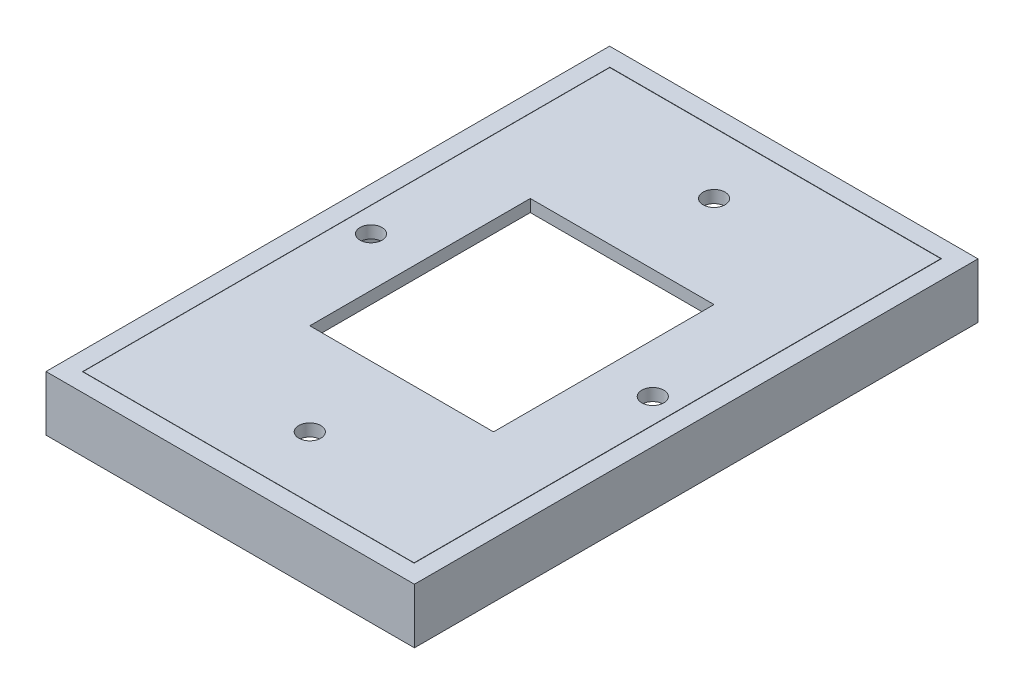
ISO-10303-21;
HEADER;
FILE_DESCRIPTION(('STEP AP214'),'2;1');
FILE_NAME('part.step','',(''),(''),'','','');
FILE_SCHEMA(('AUTOMOTIVE_DESIGN { 1 0 10303 214 1 1 1 1 }'));
ENDSEC;
DATA;
#1=APPLICATION_CONTEXT('core data for automotive mechanical design processes');
#2=APPLICATION_PROTOCOL_DEFINITION('international standard','automotive_design',2000,#1);
#3=PRODUCT_CONTEXT('',#1,'mechanical');
#4=PRODUCT('Part','Part','',(#3));
#5=PRODUCT_RELATED_PRODUCT_CATEGORY('part','',(#4));
#6=PRODUCT_DEFINITION_FORMATION('','',#4);
#7=PRODUCT_DEFINITION_CONTEXT('part definition',#1,'design');
#8=PRODUCT_DEFINITION('design','',#6,#7);
#9=PRODUCT_DEFINITION_SHAPE('','',#8);
#10=(LENGTH_UNIT() NAMED_UNIT(*) SI_UNIT(.MILLI.,.METRE.));
#11=(NAMED_UNIT(*) PLANE_ANGLE_UNIT() SI_UNIT($,.RADIAN.));
#12=(NAMED_UNIT(*) SI_UNIT($,.STERADIAN.) SOLID_ANGLE_UNIT());
#13=UNCERTAINTY_MEASURE_WITH_UNIT(LENGTH_MEASURE(1.E-05),#10,'distance_accuracy_value','');
#14=(GEOMETRIC_REPRESENTATION_CONTEXT(3) GLOBAL_UNCERTAINTY_ASSIGNED_CONTEXT((#13)) GLOBAL_UNIT_ASSIGNED_CONTEXT((#10,
#11,#12)) REPRESENTATION_CONTEXT('',''));
#15=CARTESIAN_POINT('',(0.,0.,0.));
#16=DIRECTION('',(0.,0.,1.));
#17=DIRECTION('',(1.,0.,0.));
#18=AXIS2_PLACEMENT_3D('',#15,#16,#17);
#19=CARTESIAN_POINT('',(-30.067729724105,2.,-46.0110806548268));
#20=DIRECTION('',(-1.,0.,0.));
#21=DIRECTION('',(0.,0.,1.));
#22=AXIS2_PLACEMENT_3D('',#19,#20,#21);
#23=PLANE('',#22);
#24=DIRECTION('',(0.,-1.,0.));
#25=VECTOR('',#24,1.);
#26=CARTESIAN_POINT('',(-30.067729724105,2.,-46.0110806548268));
#27=LINE('',#26,#25);
#28=CARTESIAN_POINT('',(-30.067729724105,2.,-46.0110806548268));
#29=VERTEX_POINT('',#28);
#30=CARTESIAN_POINT('',(-30.067729724105,-7.,-46.0110806548268));
#31=VERTEX_POINT('',#30);
#32=EDGE_CURVE('E58',#29,#31,#27,.T.);
#33=ORIENTED_EDGE('',*,*,#32,.T.);
#34=DIRECTION('',(0.,0.,-1.));
#35=VECTOR('',#34,1.);
#36=CARTESIAN_POINT('',(-30.067729724105,-7.,-46.0110806548268));
#37=LINE('',#36,#35);
#38=CARTESIAN_POINT('',(-30.067729724105,-7.,46.));
#39=VERTEX_POINT('',#38);
#40=EDGE_CURVE('E156',#39,#31,#37,.T.);
#41=ORIENTED_EDGE('',*,*,#40,.F.);
#42=DIRECTION('',(0.,-1.,0.));
#43=VECTOR('',#42,1.);
#44=CARTESIAN_POINT('',(-30.067729724105,2.,46.));
#45=LINE('',#44,#43);
#46=CARTESIAN_POINT('',(-30.067729724105,2.,46.));
#47=VERTEX_POINT('',#46);
#48=EDGE_CURVE('E12',#47,#39,#45,.T.);
#49=ORIENTED_EDGE('',*,*,#48,.F.);
#50=DIRECTION('',(0.,0.,-1.));
#51=VECTOR('',#50,1.);
#52=CARTESIAN_POINT('',(-30.067729724105,2.,-46.0110806548268));
#53=LINE('',#52,#51);
#54=EDGE_CURVE('E184',#47,#29,#53,.T.);
#55=ORIENTED_EDGE('',*,*,#54,.T.);
#56=EDGE_LOOP('',(#33,#41,#49,#55));
#57=FACE_BOUND('',#56,.T.);
#58=ADVANCED_FACE('F55',(#57),#23,.T.);
#59=CARTESIAN_POINT('',(30.082720595895,2.,46.));
#60=DIRECTION('',(0.,0.,1.));
#61=DIRECTION('',(1.,0.,0.));
#62=AXIS2_PLACEMENT_3D('',#59,#60,#61);
#63=PLANE('',#62);
#64=ORIENTED_EDGE('',*,*,#48,.T.);
#65=DIRECTION('',(-1.,0.,0.));
#66=VECTOR('',#65,1.);
#67=CARTESIAN_POINT('',(30.082720595895,-7.,46.));
#68=LINE('',#67,#66);
#69=CARTESIAN_POINT('',(30.082720595895,-7.,46.));
#70=VERTEX_POINT('',#69);
#71=EDGE_CURVE('E168',#70,#39,#68,.T.);
#72=ORIENTED_EDGE('',*,*,#71,.F.);
#73=DIRECTION('',(0.,-1.,0.));
#74=VECTOR('',#73,1.);
#75=CARTESIAN_POINT('',(30.082720595895,2.,46.));
#76=LINE('',#75,#74);
#77=CARTESIAN_POINT('',(30.082720595895,2.,46.));
#78=VERTEX_POINT('',#77);
#79=EDGE_CURVE('E64',#78,#70,#76,.T.);
#80=ORIENTED_EDGE('',*,*,#79,.F.);
#81=DIRECTION('',(-1.,0.,0.));
#82=VECTOR('',#81,1.);
#83=CARTESIAN_POINT('',(30.082720595895,2.,46.));
#84=LINE('',#83,#82);
#85=EDGE_CURVE('E200',#78,#47,#84,.T.);
#86=ORIENTED_EDGE('',*,*,#85,.T.);
#87=EDGE_LOOP('',(#64,#72,#80,#86));
#88=FACE_BOUND('',#87,.T.);
#89=ADVANCED_FACE('F216',(#88),#63,.T.);
#90=CARTESIAN_POINT('',(30.082720595895,2.,-46.0110806548268));
#91=DIRECTION('',(1.,0.,0.));
#92=DIRECTION('',(0.,0.,-1.));
#93=AXIS2_PLACEMENT_3D('',#90,#91,#92);
#94=PLANE('',#93);
#95=ORIENTED_EDGE('',*,*,#79,.T.);
#96=DIRECTION('',(0.,0.,1.));
#97=VECTOR('',#96,1.);
#98=CARTESIAN_POINT('',(30.082720595895,-7.,-46.0110806548268));
#99=LINE('',#98,#97);
#100=CARTESIAN_POINT('',(30.082720595895,-7.,-46.0110806548268));
#101=VERTEX_POINT('',#100);
#102=EDGE_CURVE('E164',#101,#70,#99,.T.);
#103=ORIENTED_EDGE('',*,*,#102,.F.);
#104=DIRECTION('',(0.,-1.,0.));
#105=VECTOR('',#104,1.);
#106=CARTESIAN_POINT('',(30.082720595895,2.,-46.0110806548268));
#107=LINE('',#106,#105);
#108=CARTESIAN_POINT('',(30.082720595895,2.,-46.0110806548268));
#109=VERTEX_POINT('',#108);
#110=EDGE_CURVE('E205',#109,#101,#107,.T.);
#111=ORIENTED_EDGE('',*,*,#110,.F.);
#112=DIRECTION('',(0.,0.,1.));
#113=VECTOR('',#112,1.);
#114=CARTESIAN_POINT('',(30.082720595895,2.,-46.0110806548268));
#115=LINE('',#114,#113);
#116=EDGE_CURVE('E196',#109,#78,#115,.T.);
#117=ORIENTED_EDGE('',*,*,#116,.T.);
#118=EDGE_LOOP('',(#95,#103,#111,#117));
#119=FACE_BOUND('',#118,.T.);
#120=ADVANCED_FACE('F222',(#119),#94,.T.);
#121=CARTESIAN_POINT('',(30.082720595895,2.,-46.0110806548268));
#122=DIRECTION('',(0.,0.,-1.));
#123=DIRECTION('',(-1.,0.,0.));
#124=AXIS2_PLACEMENT_3D('',#121,#122,#123);
#125=PLANE('',#124);
#126=ORIENTED_EDGE('',*,*,#110,.T.);
#127=DIRECTION('',(1.,0.,0.));
#128=VECTOR('',#127,1.);
#129=CARTESIAN_POINT('',(30.082720595895,-7.,-46.0110806548268));
#130=LINE('',#129,#128);
#131=EDGE_CURVE('E160',#31,#101,#130,.T.);
#132=ORIENTED_EDGE('',*,*,#131,.F.);
#133=ORIENTED_EDGE('',*,*,#32,.F.);
#134=DIRECTION('',(1.,0.,0.));
#135=VECTOR('',#134,1.);
#136=CARTESIAN_POINT('',(30.082720595895,2.,-46.0110806548268));
#137=LINE('',#136,#135);
#138=EDGE_CURVE('E192',#29,#109,#137,.T.);
#139=ORIENTED_EDGE('',*,*,#138,.T.);
#140=EDGE_LOOP('',(#126,#132,#133,#139));
#141=FACE_BOUND('',#140,.T.);
#142=ADVANCED_FACE('F211',(#141),#125,.T.);
#143=CARTESIAN_POINT('',(0.,2.,0.));
#144=DIRECTION('',(0.,-1.,0.));
#145=DIRECTION('',(0.,0.,-1.));
#146=AXIS2_PLACEMENT_3D('',#143,#144,#145);
#147=PLANE('',#146);
#148=DIRECTION('',(-1.,0.,0.));
#149=VECTOR('',#148,1.);
#150=CARTESIAN_POINT('',(27.082720595895,2.,43.0444596725866));
#151=LINE('',#150,#149);
#152=CARTESIAN_POINT('',(27.082720595895,2.,43.0444596725866));
#153=VERTEX_POINT('',#152);
#154=CARTESIAN_POINT('',(-27.067729724105,2.,43.0444596725866));
#155=VERTEX_POINT('',#154);
#156=EDGE_CURVE('E134',#153,#155,#151,.T.);
#157=ORIENTED_EDGE('',*,*,#156,.T.);
#158=DIRECTION('',(0.,0.,-1.));
#159=VECTOR('',#158,1.);
#160=CARTESIAN_POINT('',(-27.067729724105,2.,-43.0555403274134));
#161=LINE('',#160,#159);
#162=CARTESIAN_POINT('',(-27.067729724105,2.,-43.0555403274134));
#163=VERTEX_POINT('',#162);
#164=EDGE_CURVE('E172',#155,#163,#161,.T.);
#165=ORIENTED_EDGE('',*,*,#164,.T.);
#166=DIRECTION('',(1.,0.,0.));
#167=VECTOR('',#166,1.);
#168=CARTESIAN_POINT('',(27.082720595895,2.,-43.0555403274134));
#169=LINE('',#168,#167);
#170=CARTESIAN_POINT('',(27.082720595895,2.,-43.0555403274134));
#171=VERTEX_POINT('',#170);
#172=EDGE_CURVE('E128',#163,#171,#169,.T.);
#173=ORIENTED_EDGE('',*,*,#172,.T.);
#174=DIRECTION('',(0.,0.,1.));
#175=VECTOR('',#174,1.);
#176=CARTESIAN_POINT('',(27.082720595895,2.,-43.0555403274134));
#177=LINE('',#176,#175);
#178=EDGE_CURVE('E72',#171,#153,#177,.T.);
#179=ORIENTED_EDGE('',*,*,#178,.T.);
#180=EDGE_LOOP('',(#157,#165,#173,#179));
#181=FACE_BOUND('',#180,.T.);
#182=ORIENTED_EDGE('',*,*,#54,.F.);
#183=ORIENTED_EDGE('',*,*,#85,.F.);
#184=ORIENTED_EDGE('',*,*,#116,.F.);
#185=ORIENTED_EDGE('',*,*,#138,.F.);
#186=EDGE_LOOP('',(#182,#183,#184,#185));
#187=FACE_BOUND('',#186,.T.);
#188=ADVANCED_FACE('F220',(#181,#187),#147,.F.);
#189=CARTESIAN_POINT('',(-27.067729724105,2.,-43.0555403274134));
#190=DIRECTION('',(-1.,0.,0.));
#191=DIRECTION('',(0.,0.,1.));
#192=AXIS2_PLACEMENT_3D('',#189,#190,#191);
#193=PLANE('',#192);
#194=DIRECTION('',(0.,-1.,0.));
#195=VECTOR('',#194,1.);
#196=CARTESIAN_POINT('',(-27.067729724105,2.,43.0444596725866));
#197=LINE('',#196,#195);
#198=CARTESIAN_POINT('',(-27.067729724105,-7.,43.0444596725866));
#199=VERTEX_POINT('',#198);
#200=EDGE_CURVE('E139',#155,#199,#197,.T.);
#201=ORIENTED_EDGE('',*,*,#200,.T.);
#202=DIRECTION('',(0.,0.,-1.));
#203=VECTOR('',#202,1.);
#204=CARTESIAN_POINT('',(-27.067729724105,-7.,-43.0555403274134));
#205=LINE('',#204,#203);
#206=CARTESIAN_POINT('',(-27.067729724105,-7.,-43.0555403274134));
#207=VERTEX_POINT('',#206);
#208=EDGE_CURVE('E137',#199,#207,#205,.T.);
#209=ORIENTED_EDGE('',*,*,#208,.T.);
#210=DIRECTION('',(0.,-1.,0.));
#211=VECTOR('',#210,1.);
#212=CARTESIAN_POINT('',(-27.067729724105,2.,-43.0555403274134));
#213=LINE('',#212,#211);
#214=EDGE_CURVE('E121',#163,#207,#213,.T.);
#215=ORIENTED_EDGE('',*,*,#214,.F.);
#216=ORIENTED_EDGE('',*,*,#164,.F.);
#217=EDGE_LOOP('',(#201,#209,#215,#216));
#218=FACE_BOUND('',#217,.T.);
#219=ADVANCED_FACE('F138',(#218),#193,.F.);
#220=CARTESIAN_POINT('',(27.082720595895,2.,43.0444596725866));
#221=DIRECTION('',(0.,0.,1.));
#222=DIRECTION('',(1.,0.,0.));
#223=AXIS2_PLACEMENT_3D('',#220,#221,#222);
#224=PLANE('',#223);
#225=DIRECTION('',(0.,-1.,0.));
#226=VECTOR('',#225,1.);
#227=CARTESIAN_POINT('',(27.082720595895,2.,43.0444596725866));
#228=LINE('',#227,#226);
#229=CARTESIAN_POINT('',(27.082720595895,-7.,43.0444596725866));
#230=VERTEX_POINT('',#229);
#231=EDGE_CURVE('E185',#153,#230,#228,.T.);
#232=ORIENTED_EDGE('',*,*,#231,.T.);
#233=DIRECTION('',(-1.,0.,0.));
#234=VECTOR('',#233,1.);
#235=CARTESIAN_POINT('',(27.082720595895,-7.,43.0444596725866));
#236=LINE('',#235,#234);
#237=EDGE_CURVE('E151',#230,#199,#236,.T.);
#238=ORIENTED_EDGE('',*,*,#237,.T.);
#239=ORIENTED_EDGE('',*,*,#200,.F.);
#240=ORIENTED_EDGE('',*,*,#156,.F.);
#241=EDGE_LOOP('',(#232,#238,#239,#240));
#242=FACE_BOUND('',#241,.T.);
#243=ADVANCED_FACE('F267',(#242),#224,.F.);
#244=CARTESIAN_POINT('',(27.082720595895,2.,-43.0555403274134));
#245=DIRECTION('',(1.,0.,0.));
#246=DIRECTION('',(0.,0.,-1.));
#247=AXIS2_PLACEMENT_3D('',#244,#245,#246);
#248=PLANE('',#247);
#249=DIRECTION('',(0.,-1.,0.));
#250=VECTOR('',#249,1.);
#251=CARTESIAN_POINT('',(27.082720595895,2.,-43.0555403274134));
#252=LINE('',#251,#250);
#253=CARTESIAN_POINT('',(27.082720595895,-7.,-43.0555403274134));
#254=VERTEX_POINT('',#253);
#255=EDGE_CURVE('E133',#171,#254,#252,.T.);
#256=ORIENTED_EDGE('',*,*,#255,.T.);
#257=DIRECTION('',(0.,0.,1.));
#258=VECTOR('',#257,1.);
#259=CARTESIAN_POINT('',(27.082720595895,-7.,-43.0555403274134));
#260=LINE('',#259,#258);
#261=EDGE_CURVE('E147',#254,#230,#260,.T.);
#262=ORIENTED_EDGE('',*,*,#261,.T.);
#263=ORIENTED_EDGE('',*,*,#231,.F.);
#264=ORIENTED_EDGE('',*,*,#178,.F.);
#265=EDGE_LOOP('',(#256,#262,#263,#264));
#266=FACE_BOUND('',#265,.T.);
#267=ADVANCED_FACE('F276',(#266),#248,.F.);
#268=CARTESIAN_POINT('',(27.082720595895,2.,-43.0555403274134));
#269=DIRECTION('',(0.,0.,-1.));
#270=DIRECTION('',(-1.,0.,0.));
#271=AXIS2_PLACEMENT_3D('',#268,#269,#270);
#272=PLANE('',#271);
#273=ORIENTED_EDGE('',*,*,#214,.T.);
#274=DIRECTION('',(1.,0.,0.));
#275=VECTOR('',#274,1.);
#276=CARTESIAN_POINT('',(27.082720595895,-7.,-43.0555403274134));
#277=LINE('',#276,#275);
#278=EDGE_CURVE('E125',#207,#254,#277,.T.);
#279=ORIENTED_EDGE('',*,*,#278,.T.);
#280=ORIENTED_EDGE('',*,*,#255,.F.);
#281=ORIENTED_EDGE('',*,*,#172,.F.);
#282=EDGE_LOOP('',(#273,#279,#280,#281));
#283=FACE_BOUND('',#282,.T.);
#284=ADVANCED_FACE('F123',(#283),#272,.F.);
#285=CARTESIAN_POINT('',(0.,-7.,0.));
#286=DIRECTION('',(0.,-1.,0.));
#287=DIRECTION('',(0.,0.,-1.));
#288=AXIS2_PLACEMENT_3D('',#285,#286,#287);
#289=PLANE('',#288);
#290=ORIENTED_EDGE('',*,*,#40,.T.);
#291=ORIENTED_EDGE('',*,*,#131,.T.);
#292=ORIENTED_EDGE('',*,*,#102,.T.);
#293=ORIENTED_EDGE('',*,*,#71,.T.);
#294=EDGE_LOOP('',(#290,#291,#292,#293));
#295=FACE_BOUND('',#294,.T.);
#296=ORIENTED_EDGE('',*,*,#278,.F.);
#297=ORIENTED_EDGE('',*,*,#208,.F.);
#298=ORIENTED_EDGE('',*,*,#237,.F.);
#299=ORIENTED_EDGE('',*,*,#261,.F.);
#300=EDGE_LOOP('',(#296,#297,#298,#299));
#301=FACE_BOUND('',#300,.T.);
#302=ADVANCED_FACE('F145',(#295,#301),#289,.T.);
#303=CLOSED_SHELL('',(#58,#89,#120,#142,#188,#219,#243,#267,#284,#302));
#304=MANIFOLD_SOLID_BREP('B2',#303);
#305=CARTESIAN_POINT('',(15.,2.,0.));
#306=DIRECTION('',(-1.,0.,0.));
#307=DIRECTION('',(0.,0.,1.));
#308=AXIS2_PLACEMENT_3D('',#305,#306,#307);
#309=PLANE('',#308);
#310=DIRECTION('',(0.,0.,-1.));
#311=VECTOR('',#310,1.);
#312=CARTESIAN_POINT('',(15.,0.,0.));
#313=LINE('',#312,#311);
#314=CARTESIAN_POINT('',(15.,0.,18.));
#315=VERTEX_POINT('',#314);
#316=CARTESIAN_POINT('',(15.,0.,-18.));
#317=VERTEX_POINT('',#316);
#318=EDGE_CURVE('E421',#315,#317,#313,.T.);
#319=ORIENTED_EDGE('',*,*,#318,.F.);
#320=DIRECTION('',(0.,-1.,0.));
#321=VECTOR('',#320,1.);
#322=CARTESIAN_POINT('',(15.,2.,18.));
#323=LINE('',#322,#321);
#324=CARTESIAN_POINT('',(15.,2.,18.));
#325=VERTEX_POINT('',#324);
#326=EDGE_CURVE('E53',#325,#315,#323,.T.);
#327=ORIENTED_EDGE('',*,*,#326,.F.);
#328=DIRECTION('',(0.,0.,-1.));
#329=VECTOR('',#328,1.);
#330=CARTESIAN_POINT('',(15.,2.,0.));
#331=LINE('',#330,#329);
#332=CARTESIAN_POINT('',(15.,2.,-18.));
#333=VERTEX_POINT('',#332);
#334=EDGE_CURVE('E401',#325,#333,#331,.T.);
#335=ORIENTED_EDGE('',*,*,#334,.T.);
#336=DIRECTION('',(0.,-1.,0.));
#337=VECTOR('',#336,1.);
#338=CARTESIAN_POINT('',(15.,2.,-18.));
#339=LINE('',#338,#337);
#340=EDGE_CURVE('E363',#333,#317,#339,.T.);
#341=ORIENTED_EDGE('',*,*,#340,.T.);
#342=EDGE_LOOP('',(#319,#327,#335,#341));
#343=FACE_BOUND('',#342,.T.);
#344=ADVANCED_FACE('F309',(#343),#309,.T.);
#345=CARTESIAN_POINT('',(0.,2.,18.));
#346=DIRECTION('',(0.,0.,-1.));
#347=DIRECTION('',(-1.,0.,0.));
#348=AXIS2_PLACEMENT_3D('',#345,#346,#347);
#349=PLANE('',#348);
#350=DIRECTION('',(1.,0.,0.));
#351=VECTOR('',#350,1.);
#352=CARTESIAN_POINT('',(0.,0.,18.));
#353=LINE('',#352,#351);
#354=CARTESIAN_POINT('',(-15.,0.,18.));
#355=VERTEX_POINT('',#354);
#356=EDGE_CURVE('E391',#355,#315,#353,.T.);
#357=ORIENTED_EDGE('',*,*,#356,.F.);
#358=DIRECTION('',(0.,-1.,0.));
#359=VECTOR('',#358,1.);
#360=CARTESIAN_POINT('',(-15.,2.,18.));
#361=LINE('',#360,#359);
#362=CARTESIAN_POINT('',(-15.,2.,18.));
#363=VERTEX_POINT('',#362);
#364=EDGE_CURVE('E319',#363,#355,#361,.T.);
#365=ORIENTED_EDGE('',*,*,#364,.F.);
#366=DIRECTION('',(1.,0.,0.));
#367=VECTOR('',#366,1.);
#368=CARTESIAN_POINT('',(0.,2.,18.));
#369=LINE('',#368,#367);
#370=EDGE_CURVE('E389',#363,#325,#369,.T.);
#371=ORIENTED_EDGE('',*,*,#370,.T.);
#372=ORIENTED_EDGE('',*,*,#326,.T.);
#373=EDGE_LOOP('',(#357,#365,#371,#372));
#374=FACE_BOUND('',#373,.T.);
#375=ADVANCED_FACE('F387',(#374),#349,.T.);
#376=CARTESIAN_POINT('',(-15.,2.,0.));
#377=DIRECTION('',(-1.,0.,0.));
#378=DIRECTION('',(0.,0.,1.));
#379=AXIS2_PLACEMENT_3D('',#376,#377,#378);
#380=PLANE('',#379);
#381=DIRECTION('',(0.,0.,-1.));
#382=VECTOR('',#381,1.);
#383=CARTESIAN_POINT('',(-15.,0.,0.));
#384=LINE('',#383,#382);
#385=CARTESIAN_POINT('',(-15.,0.,-18.));
#386=VERTEX_POINT('',#385);
#387=EDGE_CURVE('E424',#355,#386,#384,.T.);
#388=ORIENTED_EDGE('',*,*,#387,.T.);
#389=DIRECTION('',(0.,-1.,0.));
#390=VECTOR('',#389,1.);
#391=CARTESIAN_POINT('',(-15.,2.,-18.));
#392=LINE('',#391,#390);
#393=CARTESIAN_POINT('',(-15.,2.,-18.));
#394=VERTEX_POINT('',#393);
#395=EDGE_CURVE('E394',#394,#386,#392,.T.);
#396=ORIENTED_EDGE('',*,*,#395,.F.);
#397=DIRECTION('',(0.,0.,-1.));
#398=VECTOR('',#397,1.);
#399=CARTESIAN_POINT('',(-15.,2.,0.));
#400=LINE('',#399,#398);
#401=EDGE_CURVE('E397',#363,#394,#400,.T.);
#402=ORIENTED_EDGE('',*,*,#401,.F.);
#403=ORIENTED_EDGE('',*,*,#364,.T.);
#404=EDGE_LOOP('',(#388,#396,#402,#403));
#405=FACE_BOUND('',#404,.T.);
#406=ADVANCED_FACE('F398',(#405),#380,.F.);
#407=CARTESIAN_POINT('',(-27.025,2.,0.));
#408=DIRECTION('',(-1.,0.,0.));
#409=DIRECTION('',(0.,0.,1.));
#410=AXIS2_PLACEMENT_3D('',#407,#408,#409);
#411=PLANE('',#410);
#412=DIRECTION('',(0.,0.,-1.));
#413=VECTOR('',#412,1.);
#414=CARTESIAN_POINT('',(-27.025,0.,0.));
#415=LINE('',#414,#413);
#416=CARTESIAN_POINT('',(-27.025,0.,43.));
#417=VERTEX_POINT('',#416);
#418=CARTESIAN_POINT('',(-27.025,0.,-43.));
#419=VERTEX_POINT('',#418);
#420=EDGE_CURVE('E409',#417,#419,#415,.T.);
#421=ORIENTED_EDGE('',*,*,#420,.F.);
#422=DIRECTION('',(0.,-1.,0.));
#423=VECTOR('',#422,1.);
#424=CARTESIAN_POINT('',(-27.025,2.,43.));
#425=LINE('',#424,#423);
#426=CARTESIAN_POINT('',(-27.025,2.,43.));
#427=VERTEX_POINT('',#426);
#428=EDGE_CURVE('E313',#427,#417,#425,.T.);
#429=ORIENTED_EDGE('',*,*,#428,.F.);
#430=DIRECTION('',(0.,0.,-1.));
#431=VECTOR('',#430,1.);
#432=CARTESIAN_POINT('',(-27.025,2.,0.));
#433=LINE('',#432,#431);
#434=CARTESIAN_POINT('',(-27.025,2.,-43.));
#435=VERTEX_POINT('',#434);
#436=EDGE_CURVE('E427',#427,#435,#433,.T.);
#437=ORIENTED_EDGE('',*,*,#436,.T.);
#438=DIRECTION('',(0.,-1.,0.));
#439=VECTOR('',#438,1.);
#440=CARTESIAN_POINT('',(-27.025,2.,-43.));
#441=LINE('',#440,#439);
#442=EDGE_CURVE('E408',#435,#419,#441,.T.);
#443=ORIENTED_EDGE('',*,*,#442,.T.);
#444=EDGE_LOOP('',(#421,#429,#437,#443));
#445=FACE_BOUND('',#444,.T.);
#446=ADVANCED_FACE('F311',(#445),#411,.T.);
#447=CARTESIAN_POINT('',(0.,2.,43.));
#448=DIRECTION('',(0.,0.,1.));
#449=DIRECTION('',(1.,0.,0.));
#450=AXIS2_PLACEMENT_3D('',#447,#448,#449);
#451=PLANE('',#450);
#452=DIRECTION('',(-1.,0.,0.));
#453=VECTOR('',#452,1.);
#454=CARTESIAN_POINT('',(0.,0.,43.));
#455=LINE('',#454,#453);
#456=CARTESIAN_POINT('',(27.025,0.,43.));
#457=VERTEX_POINT('',#456);
#458=EDGE_CURVE('E412',#457,#417,#455,.T.);
#459=ORIENTED_EDGE('',*,*,#458,.F.);
#460=DIRECTION('',(0.,-1.,0.));
#461=VECTOR('',#460,1.);
#462=CARTESIAN_POINT('',(27.025,2.,43.));
#463=LINE('',#462,#461);
#464=CARTESIAN_POINT('',(27.025,2.,43.));
#465=VERTEX_POINT('',#464);
#466=EDGE_CURVE('E433',#465,#457,#463,.T.);
#467=ORIENTED_EDGE('',*,*,#466,.F.);
#468=DIRECTION('',(-1.,0.,0.));
#469=VECTOR('',#468,1.);
#470=CARTESIAN_POINT('',(0.,2.,43.));
#471=LINE('',#470,#469);
#472=EDGE_CURVE('E442',#465,#427,#471,.T.);
#473=ORIENTED_EDGE('',*,*,#472,.T.);
#474=ORIENTED_EDGE('',*,*,#428,.T.);
#475=EDGE_LOOP('',(#459,#467,#473,#474));
#476=FACE_BOUND('',#475,.T.);
#477=ADVANCED_FACE('F440',(#476),#451,.T.);
#478=CARTESIAN_POINT('',(27.025,2.,0.));
#479=DIRECTION('',(-1.,0.,0.));
#480=DIRECTION('',(0.,0.,1.));
#481=AXIS2_PLACEMENT_3D('',#478,#479,#480);
#482=PLANE('',#481);
#483=DIRECTION('',(0.,0.,-1.));
#484=VECTOR('',#483,1.);
#485=CARTESIAN_POINT('',(27.025,0.,0.));
#486=LINE('',#485,#484);
#487=CARTESIAN_POINT('',(27.025,0.,-43.));
#488=VERTEX_POINT('',#487);
#489=EDGE_CURVE('E416',#457,#488,#486,.T.);
#490=ORIENTED_EDGE('',*,*,#489,.T.);
#491=DIRECTION('',(0.,-1.,0.));
#492=VECTOR('',#491,1.);
#493=CARTESIAN_POINT('',(27.025,2.,-43.));
#494=LINE('',#493,#492);
#495=CARTESIAN_POINT('',(27.025,2.,-43.));
#496=VERTEX_POINT('',#495);
#497=EDGE_CURVE('E431',#496,#488,#494,.T.);
#498=ORIENTED_EDGE('',*,*,#497,.F.);
#499=DIRECTION('',(0.,0.,-1.));
#500=VECTOR('',#499,1.);
#501=CARTESIAN_POINT('',(27.025,2.,0.));
#502=LINE('',#501,#500);
#503=EDGE_CURVE('E453',#465,#496,#502,.T.);
#504=ORIENTED_EDGE('',*,*,#503,.F.);
#505=ORIENTED_EDGE('',*,*,#466,.T.);
#506=EDGE_LOOP('',(#490,#498,#504,#505));
#507=FACE_BOUND('',#506,.T.);
#508=ADVANCED_FACE('F448',(#507),#482,.F.);
#509=CARTESIAN_POINT('',(0.,2.,-43.));
#510=DIRECTION('',(0.,0.,1.));
#511=DIRECTION('',(1.,0.,0.));
#512=AXIS2_PLACEMENT_3D('',#509,#510,#511);
#513=PLANE('',#512);
#514=DIRECTION('',(-1.,0.,0.));
#515=VECTOR('',#514,1.);
#516=CARTESIAN_POINT('',(0.,0.,-43.));
#517=LINE('',#516,#515);
#518=EDGE_CURVE('E418',#488,#419,#517,.T.);
#519=ORIENTED_EDGE('',*,*,#518,.T.);
#520=ORIENTED_EDGE('',*,*,#442,.F.);
#521=DIRECTION('',(-1.,0.,0.));
#522=VECTOR('',#521,1.);
#523=CARTESIAN_POINT('',(0.,2.,-43.));
#524=LINE('',#523,#522);
#525=EDGE_CURVE('E403',#496,#435,#524,.T.);
#526=ORIENTED_EDGE('',*,*,#525,.F.);
#527=ORIENTED_EDGE('',*,*,#497,.T.);
#528=EDGE_LOOP('',(#519,#520,#526,#527));
#529=FACE_BOUND('',#528,.T.);
#530=ADVANCED_FACE('F451',(#529),#513,.F.);
#531=CARTESIAN_POINT('',(0.,2.,-18.));
#532=DIRECTION('',(0.,0.,-1.));
#533=DIRECTION('',(-1.,0.,0.));
#534=AXIS2_PLACEMENT_3D('',#531,#532,#533);
#535=PLANE('',#534);
#536=DIRECTION('',(1.,0.,0.));
#537=VECTOR('',#536,1.);
#538=CARTESIAN_POINT('',(0.,0.,-18.));
#539=LINE('',#538,#537);
#540=EDGE_CURVE('E356',#386,#317,#539,.T.);
#541=ORIENTED_EDGE('',*,*,#540,.T.);
#542=ORIENTED_EDGE('',*,*,#340,.F.);
#543=DIRECTION('',(1.,0.,0.));
#544=VECTOR('',#543,1.);
#545=CARTESIAN_POINT('',(0.,2.,-18.));
#546=LINE('',#545,#544);
#547=EDGE_CURVE('E328',#394,#333,#546,.T.);
#548=ORIENTED_EDGE('',*,*,#547,.F.);
#549=ORIENTED_EDGE('',*,*,#395,.T.);
#550=EDGE_LOOP('',(#541,#542,#548,#549));
#551=FACE_BOUND('',#550,.T.);
#552=ADVANCED_FACE('F493',(#551),#535,.F.);
#553=CARTESIAN_POINT('',(0.,2.,0.));
#554=DIRECTION('',(0.,1.,0.));
#555=DIRECTION('',(0.,0.,1.));
#556=AXIS2_PLACEMENT_3D('',#553,#554,#555);
#557=PLANE('',#556);
#558=CARTESIAN_POINT('',(0.,2.,33.));
#559=DIRECTION('',(0.,1.,0.));
#560=DIRECTION('',(0.,0.,1.));
#561=AXIS2_PLACEMENT_3D('',#558,#559,#560);
#562=CIRCLE('',#561,1.8);
#563=CARTESIAN_POINT('',(0.,2.,34.8));
#564=VERTEX_POINT('',#563);
#565=EDGE_CURVE('E476',#564,#564,#562,.T.);
#566=ORIENTED_EDGE('',*,*,#565,.F.);
#567=EDGE_LOOP('',(#566));
#568=FACE_BOUND('',#567,.T.);
#569=CARTESIAN_POINT('',(-23.,2.,0.));
#570=DIRECTION('',(0.,1.,0.));
#571=DIRECTION('',(0.,0.,1.));
#572=AXIS2_PLACEMENT_3D('',#569,#570,#571);
#573=CIRCLE('',#572,1.79999999999999);
#574=CARTESIAN_POINT('',(-23.,2.,1.79999999999999));
#575=VERTEX_POINT('',#574);
#576=EDGE_CURVE('E473',#575,#575,#573,.T.);
#577=ORIENTED_EDGE('',*,*,#576,.F.);
#578=EDGE_LOOP('',(#577));
#579=FACE_BOUND('',#578,.T.);
#580=CARTESIAN_POINT('',(0.,2.,-33.));
#581=DIRECTION('',(0.,1.,0.));
#582=DIRECTION('',(0.,0.,-1.));
#583=AXIS2_PLACEMENT_3D('',#580,#581,#582);
#584=CIRCLE('',#583,1.8);
#585=CARTESIAN_POINT('',(0.,2.,-34.8));
#586=VERTEX_POINT('',#585);
#587=EDGE_CURVE('E467',#586,#586,#584,.T.);
#588=ORIENTED_EDGE('',*,*,#587,.F.);
#589=EDGE_LOOP('',(#588));
#590=FACE_BOUND('',#589,.T.);
#591=CARTESIAN_POINT('',(23.,2.,0.));
#592=DIRECTION('',(0.,1.,0.));
#593=DIRECTION('',(0.,0.,-1.));
#594=AXIS2_PLACEMENT_3D('',#591,#592,#593);
#595=CIRCLE('',#594,1.79999999999999);
#596=CARTESIAN_POINT('',(23.,2.,-1.8));
#597=VERTEX_POINT('',#596);
#598=EDGE_CURVE('E461',#597,#597,#595,.T.);
#599=ORIENTED_EDGE('',*,*,#598,.F.);
#600=EDGE_LOOP('',(#599));
#601=FACE_BOUND('',#600,.T.);
#602=ORIENTED_EDGE('',*,*,#436,.F.);
#603=ORIENTED_EDGE('',*,*,#472,.F.);
#604=ORIENTED_EDGE('',*,*,#503,.T.);
#605=ORIENTED_EDGE('',*,*,#525,.T.);
#606=EDGE_LOOP('',(#602,#603,#604,#605));
#607=FACE_BOUND('',#606,.T.);
#608=ORIENTED_EDGE('',*,*,#334,.F.);
#609=ORIENTED_EDGE('',*,*,#370,.F.);
#610=ORIENTED_EDGE('',*,*,#401,.T.);
#611=ORIENTED_EDGE('',*,*,#547,.T.);
#612=EDGE_LOOP('',(#608,#609,#610,#611));
#613=FACE_BOUND('',#612,.T.);
#614=ADVANCED_FACE('F400',(#568,#579,#590,#601,#607,#613),#557,.T.);
#615=CARTESIAN_POINT('',(0.,0.,0.));
#616=DIRECTION('',(0.,1.,0.));
#617=DIRECTION('',(0.,0.,1.));
#618=AXIS2_PLACEMENT_3D('',#615,#616,#617);
#619=PLANE('',#618);
#620=CARTESIAN_POINT('',(0.,0.,33.));
#621=DIRECTION('',(0.,1.,0.));
#622=DIRECTION('',(0.,0.,1.));
#623=AXIS2_PLACEMENT_3D('',#620,#621,#622);
#624=CIRCLE('',#623,1.8);
#625=CARTESIAN_POINT('',(0.,0.,34.8));
#626=VERTEX_POINT('',#625);
#627=EDGE_CURVE('E413',#626,#626,#624,.T.);
#628=ORIENTED_EDGE('',*,*,#627,.T.);
#629=EDGE_LOOP('',(#628));
#630=FACE_BOUND('',#629,.T.);
#631=CARTESIAN_POINT('',(-23.,0.,0.));
#632=DIRECTION('',(0.,1.,0.));
#633=DIRECTION('',(0.,0.,1.));
#634=AXIS2_PLACEMENT_3D('',#631,#632,#633);
#635=CIRCLE('',#634,1.79999999999999);
#636=CARTESIAN_POINT('',(-23.,0.,1.79999999999999));
#637=VERTEX_POINT('',#636);
#638=EDGE_CURVE('E470',#637,#637,#635,.T.);
#639=ORIENTED_EDGE('',*,*,#638,.T.);
#640=EDGE_LOOP('',(#639));
#641=FACE_BOUND('',#640,.T.);
#642=CARTESIAN_POINT('',(0.,0.,-33.));
#643=DIRECTION('',(0.,1.,0.));
#644=DIRECTION('',(0.,0.,-1.));
#645=AXIS2_PLACEMENT_3D('',#642,#643,#644);
#646=CIRCLE('',#645,1.8);
#647=CARTESIAN_POINT('',(0.,0.,-34.8));
#648=VERTEX_POINT('',#647);
#649=EDGE_CURVE('E464',#648,#648,#646,.T.);
#650=ORIENTED_EDGE('',*,*,#649,.T.);
#651=EDGE_LOOP('',(#650));
#652=FACE_BOUND('',#651,.T.);
#653=CARTESIAN_POINT('',(23.,0.,0.));
#654=DIRECTION('',(0.,1.,0.));
#655=DIRECTION('',(0.,0.,-1.));
#656=AXIS2_PLACEMENT_3D('',#653,#654,#655);
#657=CIRCLE('',#656,1.79999999999999);
#658=CARTESIAN_POINT('',(23.,0.,-1.8));
#659=VERTEX_POINT('',#658);
#660=EDGE_CURVE('E458',#659,#659,#657,.T.);
#661=ORIENTED_EDGE('',*,*,#660,.T.);
#662=EDGE_LOOP('',(#661));
#663=FACE_BOUND('',#662,.T.);
#664=ORIENTED_EDGE('',*,*,#420,.T.);
#665=ORIENTED_EDGE('',*,*,#518,.F.);
#666=ORIENTED_EDGE('',*,*,#489,.F.);
#667=ORIENTED_EDGE('',*,*,#458,.T.);
#668=EDGE_LOOP('',(#664,#665,#666,#667));
#669=FACE_BOUND('',#668,.T.);
#670=ORIENTED_EDGE('',*,*,#318,.T.);
#671=ORIENTED_EDGE('',*,*,#540,.F.);
#672=ORIENTED_EDGE('',*,*,#387,.F.);
#673=ORIENTED_EDGE('',*,*,#356,.T.);
#674=EDGE_LOOP('',(#670,#671,#672,#673));
#675=FACE_BOUND('',#674,.T.);
#676=ADVANCED_FACE('F446',(#630,#641,#652,#663,#669,#675),#619,.F.);
#677=CARTESIAN_POINT('',(23.,0.,0.));
#678=DIRECTION('',(0.,1.,0.));
#679=DIRECTION('',(0.,0.,1.));
#680=AXIS2_PLACEMENT_3D('',#677,#678,#679);
#681=CYLINDRICAL_SURFACE('',#680,1.79999999999999);
#682=ORIENTED_EDGE('',*,*,#660,.F.);
#683=EDGE_LOOP('',(#682));
#684=FACE_BOUND('',#683,.T.);
#685=ORIENTED_EDGE('',*,*,#598,.T.);
#686=EDGE_LOOP('',(#685));
#687=FACE_BOUND('',#686,.T.);
#688=ADVANCED_FACE('F501',(#684,#687),#681,.F.);
#689=CARTESIAN_POINT('',(0.,0.,-33.));
#690=DIRECTION('',(0.,1.,0.));
#691=DIRECTION('',(0.,0.,1.));
#692=AXIS2_PLACEMENT_3D('',#689,#690,#691);
#693=CYLINDRICAL_SURFACE('',#692,1.8);
#694=ORIENTED_EDGE('',*,*,#649,.F.);
#695=EDGE_LOOP('',(#694));
#696=FACE_BOUND('',#695,.T.);
#697=ORIENTED_EDGE('',*,*,#587,.T.);
#698=EDGE_LOOP('',(#697));
#699=FACE_BOUND('',#698,.T.);
#700=ADVANCED_FACE('F503',(#696,#699),#693,.F.);
#701=CARTESIAN_POINT('',(-23.,0.,0.));
#702=DIRECTION('',(0.,1.,0.));
#703=DIRECTION('',(0.,0.,1.));
#704=AXIS2_PLACEMENT_3D('',#701,#702,#703);
#705=CYLINDRICAL_SURFACE('',#704,1.79999999999999);
#706=ORIENTED_EDGE('',*,*,#638,.F.);
#707=EDGE_LOOP('',(#706));
#708=FACE_BOUND('',#707,.T.);
#709=ORIENTED_EDGE('',*,*,#576,.T.);
#710=EDGE_LOOP('',(#709));
#711=FACE_BOUND('',#710,.T.);
#712=ADVANCED_FACE('F487',(#708,#711),#705,.F.);
#713=CARTESIAN_POINT('',(0.,0.,33.));
#714=DIRECTION('',(0.,1.,0.));
#715=DIRECTION('',(0.,0.,1.));
#716=AXIS2_PLACEMENT_3D('',#713,#714,#715);
#717=CYLINDRICAL_SURFACE('',#716,1.8);
#718=ORIENTED_EDGE('',*,*,#627,.F.);
#719=EDGE_LOOP('',(#718));
#720=FACE_BOUND('',#719,.T.);
#721=ORIENTED_EDGE('',*,*,#565,.T.);
#722=EDGE_LOOP('',(#721));
#723=FACE_BOUND('',#722,.T.);
#724=ADVANCED_FACE('F484',(#720,#723),#717,.F.);
#725=CLOSED_SHELL('',(#344,#375,#406,#446,#477,#508,#530,#552,#614,#676,#688,#700,#712,#724));
#726=MANIFOLD_SOLID_BREP('B6',#725);
#727=ADVANCED_BREP_SHAPE_REPRESENTATION('',(#18,#304,#726),#14);
#728=SHAPE_DEFINITION_REPRESENTATION(#9,#727);
ENDSEC;
END-ISO-10303-21;
